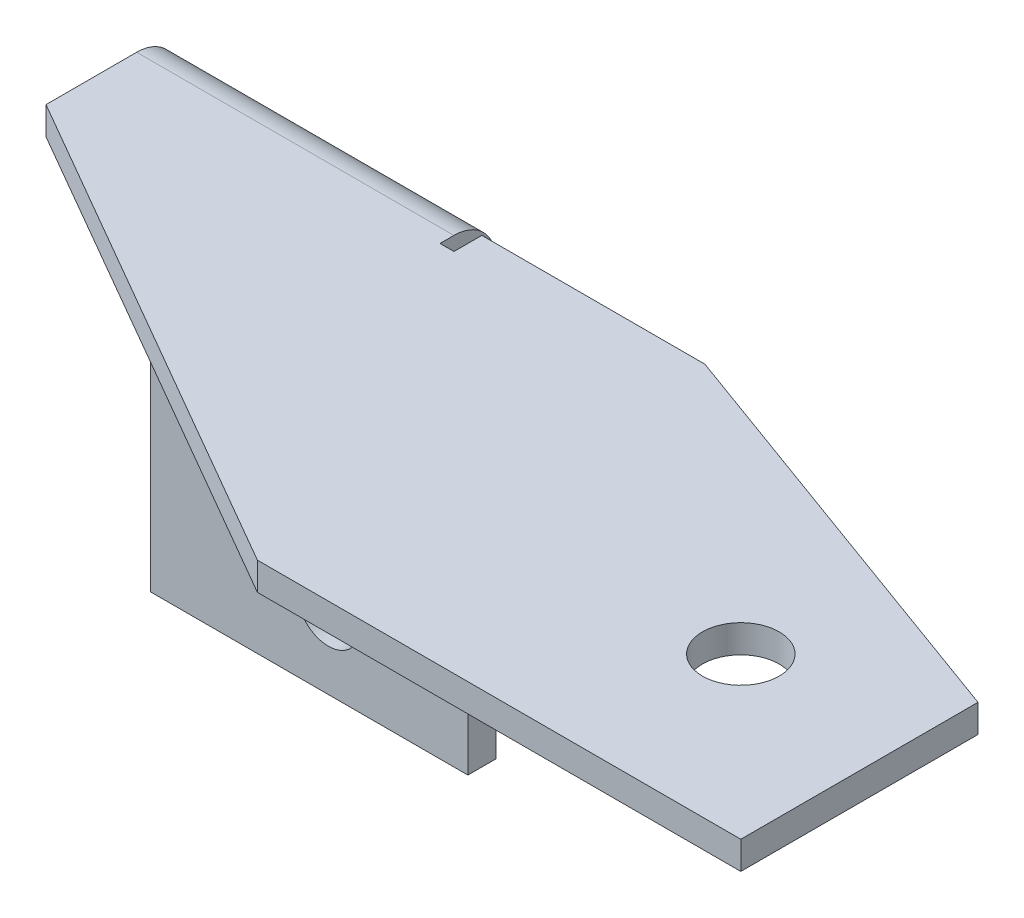
ISO-10303-21;
HEADER;
FILE_DESCRIPTION(('STEP AP214'),'2;1');
FILE_NAME('part.step','',(''),(''),'','','');
FILE_SCHEMA(('AUTOMOTIVE_DESIGN { 1 0 10303 214 1 1 1 1 }'));
ENDSEC;
DATA;
#1=APPLICATION_CONTEXT('core data for automotive mechanical design processes');
#2=APPLICATION_PROTOCOL_DEFINITION('international standard','automotive_design',2000,#1);
#3=PRODUCT_CONTEXT('',#1,'mechanical');
#4=PRODUCT('Part','Part','',(#3));
#5=PRODUCT_RELATED_PRODUCT_CATEGORY('part','',(#4));
#6=PRODUCT_DEFINITION_FORMATION('','',#4);
#7=PRODUCT_DEFINITION_CONTEXT('part definition',#1,'design');
#8=PRODUCT_DEFINITION('design','',#6,#7);
#9=PRODUCT_DEFINITION_SHAPE('','',#8);
#10=(LENGTH_UNIT() NAMED_UNIT(*) SI_UNIT(.MILLI.,.METRE.));
#11=(NAMED_UNIT(*) PLANE_ANGLE_UNIT() SI_UNIT($,.RADIAN.));
#12=(NAMED_UNIT(*) SI_UNIT($,.STERADIAN.) SOLID_ANGLE_UNIT());
#13=UNCERTAINTY_MEASURE_WITH_UNIT(LENGTH_MEASURE(1.E-05),#10,'distance_accuracy_value','');
#14=(GEOMETRIC_REPRESENTATION_CONTEXT(3) GLOBAL_UNCERTAINTY_ASSIGNED_CONTEXT((#13)) GLOBAL_UNIT_ASSIGNED_CONTEXT((#10,
#11,#12)) REPRESENTATION_CONTEXT('',''));
#15=CARTESIAN_POINT('',(0.,0.,0.));
#16=DIRECTION('',(0.,0.,1.));
#17=DIRECTION('',(1.,0.,0.));
#18=AXIS2_PLACEMENT_3D('',#15,#16,#17);
#19=CARTESIAN_POINT('',(0.,2.,0.));
#20=DIRECTION('',(0.,0.,1.));
#21=DIRECTION('',(1.,0.,0.));
#22=AXIS2_PLACEMENT_3D('',#19,#20,#21);
#23=PLANE('',#22);
#24=DIRECTION('',(0.,-1.,0.));
#25=VECTOR('',#24,1.);
#26=CARTESIAN_POINT('',(22.7379024351809,2.,0.));
#27=LINE('',#26,#25);
#28=CARTESIAN_POINT('',(22.7379024351809,-1.,0.));
#29=VERTEX_POINT('',#28);
#30=CARTESIAN_POINT('',(22.7379024351809,-32.,0.));
#31=VERTEX_POINT('',#30);
#32=EDGE_CURVE('E340',#29,#31,#27,.T.);
#33=ORIENTED_EDGE('',*,*,#32,.F.);
#34=DIRECTION('',(-1.,0.,0.));
#35=VECTOR('',#34,1.);
#36=CARTESIAN_POINT('',(0.,-1.,0.));
#37=LINE('',#36,#35);
#38=CARTESIAN_POINT('',(0.,-1.,0.));
#39=VERTEX_POINT('',#38);
#40=EDGE_CURVE('E426',#29,#39,#37,.T.);
#41=ORIENTED_EDGE('',*,*,#40,.T.);
#42=DIRECTION('',(0.,-1.,0.));
#43=VECTOR('',#42,1.);
#44=CARTESIAN_POINT('',(0.,2.,0.));
#45=LINE('',#44,#43);
#46=CARTESIAN_POINT('',(0.,-32.,0.));
#47=VERTEX_POINT('',#46);
#48=EDGE_CURVE('E336',#39,#47,#45,.T.);
#49=ORIENTED_EDGE('',*,*,#48,.T.);
#50=DIRECTION('',(-1.,0.,0.));
#51=VECTOR('',#50,1.);
#52=CARTESIAN_POINT('',(0.,-32.,0.));
#53=LINE('',#52,#51);
#54=EDGE_CURVE('E329',#31,#47,#53,.T.);
#55=ORIENTED_EDGE('',*,*,#54,.F.);
#56=EDGE_LOOP('',(#33,#41,#49,#55));
#57=FACE_BOUND('',#56,.T.);
#58=DIRECTION('',(0.,-1.,0.));
#59=VECTOR('',#58,1.);
#60=CARTESIAN_POINT('',(14.9879024351809,-12.25,0.));
#61=LINE('',#60,#59);
#62=CARTESIAN_POINT('',(14.9879024351809,-6.75000000000001,0.));
#63=VERTEX_POINT('',#62);
#64=CARTESIAN_POINT('',(14.9879024351809,-12.25,0.));
#65=VERTEX_POINT('',#64);
#66=EDGE_CURVE('E291',#63,#65,#61,.T.);
#67=ORIENTED_EDGE('',*,*,#66,.T.);
#68=CARTESIAN_POINT('',(12.7379024351809,-12.25,0.));
#69=DIRECTION('',(0.,0.,-1.));
#70=DIRECTION('',(-1.,0.,0.));
#71=AXIS2_PLACEMENT_3D('',#68,#69,#70);
#72=CIRCLE('',#71,2.25);
#73=CARTESIAN_POINT('',(10.4879024351809,-12.25,0.));
#74=VERTEX_POINT('',#73);
#75=EDGE_CURVE('E252',#65,#74,#72,.T.);
#76=ORIENTED_EDGE('',*,*,#75,.T.);
#77=DIRECTION('',(0.,1.,0.));
#78=VECTOR('',#77,1.);
#79=CARTESIAN_POINT('',(10.4879024351809,-12.25,0.));
#80=LINE('',#79,#78);
#81=CARTESIAN_POINT('',(10.4879024351809,-6.75000000000001,0.));
#82=VERTEX_POINT('',#81);
#83=EDGE_CURVE('E300',#74,#82,#80,.T.);
#84=ORIENTED_EDGE('',*,*,#83,.T.);
#85=CARTESIAN_POINT('',(12.7379024351809,-6.75000000000001,0.));
#86=DIRECTION('',(0.,0.,-1.));
#87=DIRECTION('',(-1.,0.,0.));
#88=AXIS2_PLACEMENT_3D('',#85,#86,#87);
#89=CIRCLE('',#88,2.25);
#90=EDGE_CURVE('E295',#82,#63,#89,.T.);
#91=ORIENTED_EDGE('',*,*,#90,.T.);
#92=EDGE_LOOP('',(#67,#76,#84,#91));
#93=FACE_BOUND('',#92,.T.);
#94=DIRECTION('',(0.,-1.,0.));
#95=VECTOR('',#94,1.);
#96=CARTESIAN_POINT('',(14.9879024351809,-26.75,0.));
#97=LINE('',#96,#95);
#98=CARTESIAN_POINT('',(14.9879024351809,-21.25,0.));
#99=VERTEX_POINT('',#98);
#100=CARTESIAN_POINT('',(14.9879024351809,-26.75,0.));
#101=VERTEX_POINT('',#100);
#102=EDGE_CURVE('E236',#99,#101,#97,.T.);
#103=ORIENTED_EDGE('',*,*,#102,.T.);
#104=CARTESIAN_POINT('',(12.7379024351809,-26.75,0.));
#105=DIRECTION('',(0.,0.,-1.));
#106=DIRECTION('',(-1.,0.,0.));
#107=AXIS2_PLACEMENT_3D('',#104,#105,#106);
#108=CIRCLE('',#107,2.25);
#109=CARTESIAN_POINT('',(10.4879024351809,-26.75,0.));
#110=VERTEX_POINT('',#109);
#111=EDGE_CURVE('E247',#101,#110,#108,.T.);
#112=ORIENTED_EDGE('',*,*,#111,.T.);
#113=DIRECTION('',(0.,1.,0.));
#114=VECTOR('',#113,1.);
#115=CARTESIAN_POINT('',(10.4879024351809,-26.75,0.));
#116=LINE('',#115,#114);
#117=CARTESIAN_POINT('',(10.4879024351809,-21.25,0.));
#118=VERTEX_POINT('',#117);
#119=EDGE_CURVE('E251',#110,#118,#116,.T.);
#120=ORIENTED_EDGE('',*,*,#119,.T.);
#121=CARTESIAN_POINT('',(12.7379024351809,-21.25,0.));
#122=DIRECTION('',(0.,0.,-1.));
#123=DIRECTION('',(-1.,0.,0.));
#124=AXIS2_PLACEMENT_3D('',#121,#122,#123);
#125=CIRCLE('',#124,2.25);
#126=EDGE_CURVE('E256',#118,#99,#125,.T.);
#127=ORIENTED_EDGE('',*,*,#126,.T.);
#128=EDGE_LOOP('',(#103,#112,#120,#127));
#129=FACE_BOUND('',#128,.T.);
#130=ADVANCED_FACE('F42',(#57,#93,#129),#23,.T.);
#131=CARTESIAN_POINT('',(22.7379024351809,2.,-2.));
#132=DIRECTION('',(0.,0.,-1.));
#133=DIRECTION('',(-1.,0.,0.));
#134=AXIS2_PLACEMENT_3D('',#131,#132,#133);
#135=PLANE('',#134);
#136=DIRECTION('',(0.,-1.,0.));
#137=VECTOR('',#136,1.);
#138=CARTESIAN_POINT('',(0.,2.,-2.));
#139=LINE('',#138,#137);
#140=CARTESIAN_POINT('',(0.,-1.,-2.));
#141=VERTEX_POINT('',#140);
#142=CARTESIAN_POINT('',(0.,-32.,-2.));
#143=VERTEX_POINT('',#142);
#144=EDGE_CURVE('E335',#141,#143,#139,.T.);
#145=ORIENTED_EDGE('',*,*,#144,.F.);
#146=DIRECTION('',(1.,0.,0.));
#147=VECTOR('',#146,1.);
#148=CARTESIAN_POINT('',(22.7379024351809,-1.,-2.));
#149=LINE('',#148,#147);
#150=CARTESIAN_POINT('',(22.7379024351809,-1.,-2.));
#151=VERTEX_POINT('',#150);
#152=EDGE_CURVE('E413',#141,#151,#149,.T.);
#153=ORIENTED_EDGE('',*,*,#152,.T.);
#154=DIRECTION('',(0.,-1.,0.));
#155=VECTOR('',#154,1.);
#156=CARTESIAN_POINT('',(22.7379024351809,2.,-2.));
#157=LINE('',#156,#155);
#158=CARTESIAN_POINT('',(22.7379024351809,-32.,-2.));
#159=VERTEX_POINT('',#158);
#160=EDGE_CURVE('E343',#151,#159,#157,.T.);
#161=ORIENTED_EDGE('',*,*,#160,.T.);
#162=DIRECTION('',(1.,0.,0.));
#163=VECTOR('',#162,1.);
#164=CARTESIAN_POINT('',(22.7379024351809,-32.,-2.));
#165=LINE('',#164,#163);
#166=EDGE_CURVE('E321',#143,#159,#165,.T.);
#167=ORIENTED_EDGE('',*,*,#166,.F.);
#168=EDGE_LOOP('',(#145,#153,#161,#167));
#169=FACE_BOUND('',#168,.T.);
#170=DIRECTION('',(0.,1.,0.));
#171=VECTOR('',#170,1.);
#172=CARTESIAN_POINT('',(10.4879024351809,-12.25,-2.));
#173=LINE('',#172,#171);
#174=CARTESIAN_POINT('',(10.4879024351809,-12.25,-2.));
#175=VERTEX_POINT('',#174);
#176=CARTESIAN_POINT('',(10.4879024351809,-6.75000000000001,-2.));
#177=VERTEX_POINT('',#176);
#178=EDGE_CURVE('E313',#175,#177,#173,.T.);
#179=ORIENTED_EDGE('',*,*,#178,.F.);
#180=CARTESIAN_POINT('',(12.7379024351809,-12.25,-2.));
#181=DIRECTION('',(0.,0.,-1.));
#182=DIRECTION('',(-1.,0.,0.));
#183=AXIS2_PLACEMENT_3D('',#180,#181,#182);
#184=CIRCLE('',#183,2.25);
#185=CARTESIAN_POINT('',(14.9879024351809,-12.25,-2.));
#186=VERTEX_POINT('',#185);
#187=EDGE_CURVE('E296',#186,#175,#184,.T.);
#188=ORIENTED_EDGE('',*,*,#187,.F.);
#189=DIRECTION('',(0.,-1.,0.));
#190=VECTOR('',#189,1.);
#191=CARTESIAN_POINT('',(14.9879024351809,-12.25,-2.));
#192=LINE('',#191,#190);
#193=CARTESIAN_POINT('',(14.9879024351809,-6.75000000000001,-2.));
#194=VERTEX_POINT('',#193);
#195=EDGE_CURVE('E290',#194,#186,#192,.T.);
#196=ORIENTED_EDGE('',*,*,#195,.F.);
#197=CARTESIAN_POINT('',(12.7379024351809,-6.75000000000001,-2.));
#198=DIRECTION('',(0.,0.,-1.));
#199=DIRECTION('',(-1.,0.,0.));
#200=AXIS2_PLACEMENT_3D('',#197,#198,#199);
#201=CIRCLE('',#200,2.25);
#202=EDGE_CURVE('E309',#177,#194,#201,.T.);
#203=ORIENTED_EDGE('',*,*,#202,.F.);
#204=EDGE_LOOP('',(#179,#188,#196,#203));
#205=FACE_BOUND('',#204,.T.);
#206=DIRECTION('',(0.,1.,0.));
#207=VECTOR('',#206,1.);
#208=CARTESIAN_POINT('',(10.4879024351809,-26.75,-2.));
#209=LINE('',#208,#207);
#210=CARTESIAN_POINT('',(10.4879024351809,-26.75,-2.));
#211=VERTEX_POINT('',#210);
#212=CARTESIAN_POINT('',(10.4879024351809,-21.25,-2.));
#213=VERTEX_POINT('',#212);
#214=EDGE_CURVE('E235',#211,#213,#209,.T.);
#215=ORIENTED_EDGE('',*,*,#214,.F.);
#216=CARTESIAN_POINT('',(12.7379024351809,-26.75,-2.));
#217=DIRECTION('',(0.,0.,-1.));
#218=DIRECTION('',(-1.,0.,0.));
#219=AXIS2_PLACEMENT_3D('',#216,#217,#218);
#220=CIRCLE('',#219,2.25);
#221=CARTESIAN_POINT('',(14.9879024351809,-26.75,-2.));
#222=VERTEX_POINT('',#221);
#223=EDGE_CURVE('E232',#222,#211,#220,.T.);
#224=ORIENTED_EDGE('',*,*,#223,.F.);
#225=DIRECTION('',(0.,-1.,0.));
#226=VECTOR('',#225,1.);
#227=CARTESIAN_POINT('',(14.9879024351809,-26.75,-2.));
#228=LINE('',#227,#226);
#229=CARTESIAN_POINT('',(14.9879024351809,-21.25,-2.));
#230=VERTEX_POINT('',#229);
#231=EDGE_CURVE('E243',#230,#222,#228,.T.);
#232=ORIENTED_EDGE('',*,*,#231,.F.);
#233=CARTESIAN_POINT('',(12.7379024351809,-21.25,-2.));
#234=DIRECTION('',(0.,0.,-1.));
#235=DIRECTION('',(-1.,0.,0.));
#236=AXIS2_PLACEMENT_3D('',#233,#234,#235);
#237=CIRCLE('',#236,2.25);
#238=EDGE_CURVE('E239',#213,#230,#237,.T.);
#239=ORIENTED_EDGE('',*,*,#238,.F.);
#240=EDGE_LOOP('',(#215,#224,#232,#239));
#241=FACE_BOUND('',#240,.T.);
#242=ADVANCED_FACE('F453',(#169,#205,#241),#135,.T.);
#243=CARTESIAN_POINT('',(0.,2.,0.));
#244=DIRECTION('',(0.,0.,1.));
#245=DIRECTION('',(1.,0.,0.));
#246=AXIS2_PLACEMENT_3D('',#243,#244,#245);
#247=PLANE('',#246);
#248=DIRECTION('',(-1.,0.,0.));
#249=VECTOR('',#248,1.);
#250=CARTESIAN_POINT('',(0.,0.,0.));
#251=LINE('',#250,#249);
#252=CARTESIAN_POINT('',(39.7282529021083,0.,0.));
#253=VERTEX_POINT('',#252);
#254=CARTESIAN_POINT('',(23.7379024351809,0.,0.));
#255=VERTEX_POINT('',#254);
#256=EDGE_CURVE('E360',#253,#255,#251,.T.);
#257=ORIENTED_EDGE('',*,*,#256,.T.);
#258=DIRECTION('',(0.,1.,0.));
#259=VECTOR('',#258,1.);
#260=CARTESIAN_POINT('',(23.7379024351809,0.,0.));
#261=LINE('',#260,#259);
#262=CARTESIAN_POINT('',(23.7379024351809,2.,0.));
#263=VERTEX_POINT('',#262);
#264=EDGE_CURVE('E225',#255,#263,#261,.T.);
#265=ORIENTED_EDGE('',*,*,#264,.T.);
#266=DIRECTION('',(-1.,0.,0.));
#267=VECTOR('',#266,1.);
#268=CARTESIAN_POINT('',(0.,2.,0.));
#269=LINE('',#268,#267);
#270=CARTESIAN_POINT('',(39.7282529021083,2.,0.));
#271=VERTEX_POINT('',#270);
#272=EDGE_CURVE('E372',#271,#263,#269,.T.);
#273=ORIENTED_EDGE('',*,*,#272,.F.);
#274=DIRECTION('',(0.,-1.,0.));
#275=VECTOR('',#274,1.);
#276=CARTESIAN_POINT('',(39.7282529021083,2.,0.));
#277=LINE('',#276,#275);
#278=EDGE_CURVE('E376',#271,#253,#277,.T.);
#279=ORIENTED_EDGE('',*,*,#278,.T.);
#280=EDGE_LOOP('',(#257,#265,#273,#279));
#281=FACE_BOUND('',#280,.T.);
#282=ADVANCED_FACE('F458',(#281),#247,.F.);
#283=CARTESIAN_POINT('',(0.,2.,7.5));
#284=DIRECTION('',(1.,0.,0.));
#285=DIRECTION('',(0.,0.,-1.));
#286=AXIS2_PLACEMENT_3D('',#283,#284,#285);
#287=PLANE('',#286);
#288=DIRECTION('',(0.,0.,1.));
#289=VECTOR('',#288,1.);
#290=CARTESIAN_POINT('',(0.,2.,7.5));
#291=LINE('',#290,#289);
#292=CARTESIAN_POINT('',(0.,2.,0.999999999999998));
#293=VERTEX_POINT('',#292);
#294=CARTESIAN_POINT('',(0.,2.,7.5));
#295=VERTEX_POINT('',#294);
#296=EDGE_CURVE('E356',#293,#295,#291,.T.);
#297=ORIENTED_EDGE('',*,*,#296,.F.);
#298=CARTESIAN_POINT('',(0.,-1.,0.999999999999997));
#299=DIRECTION('',(1.,0.,0.));
#300=DIRECTION('',(0.,0.,-1.));
#301=AXIS2_PLACEMENT_3D('',#298,#299,#300);
#302=CIRCLE('',#301,3.);
#303=EDGE_CURVE('E423',#293,#141,#302,.F.);
#304=ORIENTED_EDGE('',*,*,#303,.T.);
#305=ORIENTED_EDGE('',*,*,#144,.T.);
#306=DIRECTION('',(0.,0.,-1.));
#307=VECTOR('',#306,1.);
#308=CARTESIAN_POINT('',(0.,-32.,-2.));
#309=LINE('',#308,#307);
#310=EDGE_CURVE('E276',#47,#143,#309,.T.);
#311=ORIENTED_EDGE('',*,*,#310,.F.);
#312=ORIENTED_EDGE('',*,*,#48,.F.);
#313=CARTESIAN_POINT('',(0.,-1.,1.));
#314=DIRECTION('',(1.,0.,0.));
#315=DIRECTION('',(0.,0.,-1.));
#316=AXIS2_PLACEMENT_3D('',#313,#314,#315);
#317=CIRCLE('',#316,1.);
#318=CARTESIAN_POINT('',(0.,0.,1.));
#319=VERTEX_POINT('',#318);
#320=EDGE_CURVE('E51',#39,#319,#317,.T.);
#321=ORIENTED_EDGE('',*,*,#320,.T.);
#322=DIRECTION('',(0.,0.,1.));
#323=VECTOR('',#322,1.);
#324=CARTESIAN_POINT('',(0.,0.,7.5));
#325=LINE('',#324,#323);
#326=CARTESIAN_POINT('',(0.,0.,7.5));
#327=VERTEX_POINT('',#326);
#328=EDGE_CURVE('E352',#319,#327,#325,.T.);
#329=ORIENTED_EDGE('',*,*,#328,.T.);
#330=DIRECTION('',(0.,-1.,0.));
#331=VECTOR('',#330,1.);
#332=CARTESIAN_POINT('',(0.,2.,7.5));
#333=LINE('',#332,#331);
#334=EDGE_CURVE('E409',#295,#327,#333,.T.);
#335=ORIENTED_EDGE('',*,*,#334,.F.);
#336=EDGE_LOOP('',(#297,#304,#305,#311,#312,#321,#329,#335));
#337=FACE_BOUND('',#336,.T.);
#338=ADVANCED_FACE('F440',(#337),#287,.F.);
#339=CARTESIAN_POINT('',(35.853451716676,2.,28.2));
#340=DIRECTION('',(0.499999999999998,0.,-0.86602540378444));
#341=DIRECTION('',(-0.86602540378444,0.,-0.499999999999998));
#342=AXIS2_PLACEMENT_3D('',#339,#340,#341);
#343=PLANE('',#342);
#344=DIRECTION('',(0.86602540378444,0.,0.499999999999998));
#345=VECTOR('',#344,1.);
#346=CARTESIAN_POINT('',(35.853451716676,0.,28.2));
#347=LINE('',#346,#345);
#348=CARTESIAN_POINT('',(35.853451716676,0.,28.2));
#349=VERTEX_POINT('',#348);
#350=EDGE_CURVE('E379',#327,#349,#347,.T.);
#351=ORIENTED_EDGE('',*,*,#350,.T.);
#352=DIRECTION('',(0.,-1.,0.));
#353=VECTOR('',#352,1.);
#354=CARTESIAN_POINT('',(35.853451716676,2.,28.2));
#355=LINE('',#354,#353);
#356=CARTESIAN_POINT('',(35.853451716676,2.,28.2));
#357=VERTEX_POINT('',#356);
#358=EDGE_CURVE('E405',#357,#349,#355,.T.);
#359=ORIENTED_EDGE('',*,*,#358,.F.);
#360=DIRECTION('',(0.86602540378444,0.,0.499999999999998));
#361=VECTOR('',#360,1.);
#362=CARTESIAN_POINT('',(35.853451716676,2.,28.2));
#363=LINE('',#362,#361);
#364=EDGE_CURVE('E359',#295,#357,#363,.T.);
#365=ORIENTED_EDGE('',*,*,#364,.F.);
#366=ORIENTED_EDGE('',*,*,#334,.T.);
#367=EDGE_LOOP('',(#351,#359,#365,#366));
#368=FACE_BOUND('',#367,.T.);
#369=ADVANCED_FACE('F490',(#368),#343,.F.);
#370=CARTESIAN_POINT('',(70.5,2.,28.2));
#371=DIRECTION('',(0.,0.,-1.));
#372=DIRECTION('',(-1.,0.,0.));
#373=AXIS2_PLACEMENT_3D('',#370,#371,#372);
#374=PLANE('',#373);
#375=DIRECTION('',(1.,0.,0.));
#376=VECTOR('',#375,1.);
#377=CARTESIAN_POINT('',(70.5,0.,28.2));
#378=LINE('',#377,#376);
#379=CARTESIAN_POINT('',(70.5,0.,28.2));
#380=VERTEX_POINT('',#379);
#381=EDGE_CURVE('E382',#349,#380,#378,.T.);
#382=ORIENTED_EDGE('',*,*,#381,.T.);
#383=DIRECTION('',(0.,-1.,0.));
#384=VECTOR('',#383,1.);
#385=CARTESIAN_POINT('',(70.5,2.,28.2));
#386=LINE('',#385,#384);
#387=CARTESIAN_POINT('',(70.5,2.,28.2));
#388=VERTEX_POINT('',#387);
#389=EDGE_CURVE('E401',#388,#380,#386,.T.);
#390=ORIENTED_EDGE('',*,*,#389,.F.);
#391=DIRECTION('',(1.,0.,0.));
#392=VECTOR('',#391,1.);
#393=CARTESIAN_POINT('',(70.5,2.,28.2));
#394=LINE('',#393,#392);
#395=EDGE_CURVE('E363',#357,#388,#394,.T.);
#396=ORIENTED_EDGE('',*,*,#395,.F.);
#397=ORIENTED_EDGE('',*,*,#358,.T.);
#398=EDGE_LOOP('',(#382,#390,#396,#397));
#399=FACE_BOUND('',#398,.T.);
#400=ADVANCED_FACE('F486',(#399),#374,.F.);
#401=CARTESIAN_POINT('',(70.5,2.,11.2));
#402=DIRECTION('',(-1.,0.,0.));
#403=DIRECTION('',(0.,0.,1.));
#404=AXIS2_PLACEMENT_3D('',#401,#402,#403);
#405=PLANE('',#404);
#406=DIRECTION('',(0.,0.,-1.));
#407=VECTOR('',#406,1.);
#408=CARTESIAN_POINT('',(70.5,0.,11.2));
#409=LINE('',#408,#407);
#410=CARTESIAN_POINT('',(70.5,0.,11.2));
#411=VERTEX_POINT('',#410);
#412=EDGE_CURVE('E385',#380,#411,#409,.T.);
#413=ORIENTED_EDGE('',*,*,#412,.T.);
#414=DIRECTION('',(0.,-1.,0.));
#415=VECTOR('',#414,1.);
#416=CARTESIAN_POINT('',(70.5,2.,11.2));
#417=LINE('',#416,#415);
#418=CARTESIAN_POINT('',(70.5,2.,11.2));
#419=VERTEX_POINT('',#418);
#420=EDGE_CURVE('E397',#419,#411,#417,.T.);
#421=ORIENTED_EDGE('',*,*,#420,.F.);
#422=DIRECTION('',(0.,0.,-1.));
#423=VECTOR('',#422,1.);
#424=CARTESIAN_POINT('',(70.5,2.,11.2));
#425=LINE('',#424,#423);
#426=EDGE_CURVE('E366',#388,#419,#425,.T.);
#427=ORIENTED_EDGE('',*,*,#426,.F.);
#428=ORIENTED_EDGE('',*,*,#389,.T.);
#429=EDGE_LOOP('',(#413,#421,#427,#428));
#430=FACE_BOUND('',#429,.T.);
#431=ADVANCED_FACE('F482',(#430),#405,.F.);
#432=CARTESIAN_POINT('',(39.7282529021083,2.,0.));
#433=DIRECTION('',(-0.34202014332567,0.,0.939692620785908));
#434=DIRECTION('',(0.939692620785908,0.,0.34202014332567));
#435=AXIS2_PLACEMENT_3D('',#432,#433,#434);
#436=PLANE('',#435);
#437=DIRECTION('',(-0.939692620785908,0.,-0.34202014332567));
#438=VECTOR('',#437,1.);
#439=CARTESIAN_POINT('',(39.7282529021083,0.,0.));
#440=LINE('',#439,#438);
#441=EDGE_CURVE('E388',#411,#253,#440,.T.);
#442=ORIENTED_EDGE('',*,*,#441,.T.);
#443=ORIENTED_EDGE('',*,*,#278,.F.);
#444=DIRECTION('',(-0.939692620785908,0.,-0.34202014332567));
#445=VECTOR('',#444,1.);
#446=CARTESIAN_POINT('',(39.7282529021083,2.,0.));
#447=LINE('',#446,#445);
#448=EDGE_CURVE('E369',#419,#271,#447,.T.);
#449=ORIENTED_EDGE('',*,*,#448,.F.);
#450=ORIENTED_EDGE('',*,*,#420,.T.);
#451=EDGE_LOOP('',(#442,#443,#449,#450));
#452=FACE_BOUND('',#451,.T.);
#453=ADVANCED_FACE('F473',(#452),#436,.F.);
#454=CARTESIAN_POINT('',(0.,2.,0.));
#455=DIRECTION('',(0.,-1.,0.));
#456=DIRECTION('',(0.,0.,-1.));
#457=AXIS2_PLACEMENT_3D('',#454,#455,#456);
#458=PLANE('',#457);
#459=CARTESIAN_POINT('',(59.,2.,16.7));
#460=DIRECTION('',(0.,1.,0.));
#461=DIRECTION('',(0.,0.,1.));
#462=AXIS2_PLACEMENT_3D('',#459,#460,#461);
#463=CIRCLE('',#462,2.75);
#464=CARTESIAN_POINT('',(59.,2.,19.45));
#465=VERTEX_POINT('',#464);
#466=EDGE_CURVE('E339',#465,#465,#463,.T.);
#467=ORIENTED_EDGE('',*,*,#466,.F.);
#468=EDGE_LOOP('',(#467));
#469=FACE_BOUND('',#468,.T.);
#470=DIRECTION('',(0.,0.,1.));
#471=VECTOR('',#470,1.);
#472=CARTESIAN_POINT('',(22.7379024351809,2.,0.));
#473=LINE('',#472,#471);
#474=CARTESIAN_POINT('',(22.7379024351809,2.,1.));
#475=VERTEX_POINT('',#474);
#476=CARTESIAN_POINT('',(22.7379024351809,2.,2.));
#477=VERTEX_POINT('',#476);
#478=EDGE_CURVE('E205',#475,#477,#473,.T.);
#479=ORIENTED_EDGE('',*,*,#478,.F.);
#480=DIRECTION('',(1.,0.,0.));
#481=VECTOR('',#480,1.);
#482=CARTESIAN_POINT('',(0.,2.,0.999999999999997));
#483=LINE('',#482,#481);
#484=EDGE_CURVE('E420',#475,#293,#483,.F.);
#485=ORIENTED_EDGE('',*,*,#484,.T.);
#486=ORIENTED_EDGE('',*,*,#296,.T.);
#487=ORIENTED_EDGE('',*,*,#364,.T.);
#488=ORIENTED_EDGE('',*,*,#395,.T.);
#489=ORIENTED_EDGE('',*,*,#426,.T.);
#490=ORIENTED_EDGE('',*,*,#448,.T.);
#491=ORIENTED_EDGE('',*,*,#272,.T.);
#492=DIRECTION('',(0.,0.,-1.));
#493=VECTOR('',#492,1.);
#494=CARTESIAN_POINT('',(23.7379024351809,2.,2.));
#495=LINE('',#494,#493);
#496=CARTESIAN_POINT('',(23.7379024351809,2.,2.));
#497=VERTEX_POINT('',#496);
#498=EDGE_CURVE('E198',#497,#263,#495,.T.);
#499=ORIENTED_EDGE('',*,*,#498,.F.);
#500=DIRECTION('',(1.,0.,0.));
#501=VECTOR('',#500,1.);
#502=CARTESIAN_POINT('',(22.7379024351809,2.,2.));
#503=LINE('',#502,#501);
#504=EDGE_CURVE('E220',#477,#497,#503,.T.);
#505=ORIENTED_EDGE('',*,*,#504,.F.);
#506=EDGE_LOOP('',(#479,#485,#486,#487,#488,#489,#490,#491,#499,#505));
#507=FACE_BOUND('',#506,.T.);
#508=ADVANCED_FACE('F470',(#469,#507),#458,.F.);
#509=CARTESIAN_POINT('',(0.,0.,0.));
#510=DIRECTION('',(0.,-1.,0.));
#511=DIRECTION('',(0.,0.,-1.));
#512=AXIS2_PLACEMENT_3D('',#509,#510,#511);
#513=PLANE('',#512);
#514=ORIENTED_EDGE('',*,*,#328,.F.);
#515=DIRECTION('',(-1.,0.,0.));
#516=VECTOR('',#515,1.);
#517=CARTESIAN_POINT('',(22.7379024351809,0.,1.));
#518=LINE('',#517,#516);
#519=CARTESIAN_POINT('',(22.7379024351809,0.,1.));
#520=VERTEX_POINT('',#519);
#521=EDGE_CURVE('E58',#319,#520,#518,.F.);
#522=ORIENTED_EDGE('',*,*,#521,.T.);
#523=DIRECTION('',(0.,0.,1.));
#524=VECTOR('',#523,1.);
#525=CARTESIAN_POINT('',(22.7379024351809,0.,0.));
#526=LINE('',#525,#524);
#527=CARTESIAN_POINT('',(22.7379024351809,0.,2.));
#528=VERTEX_POINT('',#527);
#529=EDGE_CURVE('E188',#520,#528,#526,.T.);
#530=ORIENTED_EDGE('',*,*,#529,.T.);
#531=DIRECTION('',(1.,0.,0.));
#532=VECTOR('',#531,1.);
#533=CARTESIAN_POINT('',(22.7379024351809,0.,2.));
#534=LINE('',#533,#532);
#535=CARTESIAN_POINT('',(23.7379024351809,0.,2.));
#536=VERTEX_POINT('',#535);
#537=EDGE_CURVE('E194',#528,#536,#534,.T.);
#538=ORIENTED_EDGE('',*,*,#537,.T.);
#539=DIRECTION('',(0.,0.,-1.));
#540=VECTOR('',#539,1.);
#541=CARTESIAN_POINT('',(23.7379024351809,0.,2.));
#542=LINE('',#541,#540);
#543=EDGE_CURVE('E211',#536,#255,#542,.T.);
#544=ORIENTED_EDGE('',*,*,#543,.T.);
#545=ORIENTED_EDGE('',*,*,#256,.F.);
#546=ORIENTED_EDGE('',*,*,#441,.F.);
#547=ORIENTED_EDGE('',*,*,#412,.F.);
#548=ORIENTED_EDGE('',*,*,#381,.F.);
#549=ORIENTED_EDGE('',*,*,#350,.F.);
#550=EDGE_LOOP('',(#514,#522,#530,#538,#544,#545,#546,#547,#548,#549));
#551=FACE_BOUND('',#550,.T.);
#552=CARTESIAN_POINT('',(59.,0.,16.7));
#553=DIRECTION('',(0.,1.,0.));
#554=DIRECTION('',(0.,0.,1.));
#555=AXIS2_PLACEMENT_3D('',#552,#553,#554);
#556=CIRCLE('',#555,2.75);
#557=CARTESIAN_POINT('',(59.,0.,19.45));
#558=VERTEX_POINT('',#557);
#559=EDGE_CURVE('E348',#558,#558,#556,.T.);
#560=ORIENTED_EDGE('',*,*,#559,.T.);
#561=EDGE_LOOP('',(#560));
#562=FACE_BOUND('',#561,.T.);
#563=ADVANCED_FACE('F190',(#551,#562),#513,.T.);
#564=CARTESIAN_POINT('',(59.,0.,16.7));
#565=DIRECTION('',(0.,1.,0.));
#566=DIRECTION('',(0.,0.,1.));
#567=AXIS2_PLACEMENT_3D('',#564,#565,#566);
#568=CYLINDRICAL_SURFACE('',#567,2.75);
#569=ORIENTED_EDGE('',*,*,#559,.F.);
#570=EDGE_LOOP('',(#569));
#571=FACE_BOUND('',#570,.T.);
#572=ORIENTED_EDGE('',*,*,#466,.T.);
#573=EDGE_LOOP('',(#572));
#574=FACE_BOUND('',#573,.T.);
#575=ADVANCED_FACE('F465',(#571,#574),#568,.F.);
#576=CARTESIAN_POINT('',(22.7379024351809,2.,0.));
#577=DIRECTION('',(1.,0.,0.));
#578=DIRECTION('',(0.,0.,-1.));
#579=AXIS2_PLACEMENT_3D('',#576,#577,#578);
#580=PLANE('',#579);
#581=ORIENTED_EDGE('',*,*,#160,.F.);
#582=CARTESIAN_POINT('',(22.7379024351809,-1.,1.));
#583=DIRECTION('',(1.,0.,0.));
#584=DIRECTION('',(0.,0.,-1.));
#585=AXIS2_PLACEMENT_3D('',#582,#583,#584);
#586=CIRCLE('',#585,3.);
#587=EDGE_CURVE('E417',#151,#475,#586,.T.);
#588=ORIENTED_EDGE('',*,*,#587,.T.);
#589=ORIENTED_EDGE('',*,*,#478,.T.);
#590=DIRECTION('',(0.,1.,0.));
#591=VECTOR('',#590,1.);
#592=CARTESIAN_POINT('',(22.7379024351809,0.,2.));
#593=LINE('',#592,#591);
#594=EDGE_CURVE('E201',#528,#477,#593,.T.);
#595=ORIENTED_EDGE('',*,*,#594,.F.);
#596=ORIENTED_EDGE('',*,*,#529,.F.);
#597=CARTESIAN_POINT('',(22.7379024351809,-1.,1.));
#598=DIRECTION('',(1.,0.,0.));
#599=DIRECTION('',(0.,0.,-1.));
#600=AXIS2_PLACEMENT_3D('',#597,#598,#599);
#601=CIRCLE('',#600,1.);
#602=EDGE_CURVE('E11',#520,#29,#601,.F.);
#603=ORIENTED_EDGE('',*,*,#602,.T.);
#604=ORIENTED_EDGE('',*,*,#32,.T.);
#605=DIRECTION('',(0.,0.,1.));
#606=VECTOR('',#605,1.);
#607=CARTESIAN_POINT('',(22.7379024351809,-32.,0.));
#608=LINE('',#607,#606);
#609=EDGE_CURVE('E325',#159,#31,#608,.T.);
#610=ORIENTED_EDGE('',*,*,#609,.F.);
#611=EDGE_LOOP('',(#581,#588,#589,#595,#596,#603,#604,#610));
#612=FACE_BOUND('',#611,.T.);
#613=ADVANCED_FACE('F203',(#612),#580,.T.);
#614=CARTESIAN_POINT('',(0.,-32.,0.));
#615=DIRECTION('',(0.,1.,0.));
#616=DIRECTION('',(0.,0.,1.));
#617=AXIS2_PLACEMENT_3D('',#614,#615,#616);
#618=PLANE('',#617);
#619=ORIENTED_EDGE('',*,*,#310,.T.);
#620=ORIENTED_EDGE('',*,*,#166,.T.);
#621=ORIENTED_EDGE('',*,*,#609,.T.);
#622=ORIENTED_EDGE('',*,*,#54,.T.);
#623=EDGE_LOOP('',(#619,#620,#621,#622));
#624=FACE_BOUND('',#623,.T.);
#625=ADVANCED_FACE('F444',(#624),#618,.F.);
#626=CARTESIAN_POINT('',(12.7379024351809,-12.25,-2.));
#627=DIRECTION('',(0.,0.,1.));
#628=DIRECTION('',(1.,0.,0.));
#629=AXIS2_PLACEMENT_3D('',#626,#627,#628);
#630=CYLINDRICAL_SURFACE('',#629,2.25);
#631=ORIENTED_EDGE('',*,*,#75,.F.);
#632=DIRECTION('',(0.,0.,1.));
#633=VECTOR('',#632,1.);
#634=CARTESIAN_POINT('',(14.9879024351809,-12.25,-2.));
#635=LINE('',#634,#633);
#636=EDGE_CURVE('E286',#186,#65,#635,.T.);
#637=ORIENTED_EDGE('',*,*,#636,.F.);
#638=ORIENTED_EDGE('',*,*,#187,.T.);
#639=DIRECTION('',(0.,0.,1.));
#640=VECTOR('',#639,1.);
#641=CARTESIAN_POINT('',(10.4879024351809,-12.25,-2.));
#642=LINE('',#641,#640);
#643=EDGE_CURVE('E229',#175,#74,#642,.T.);
#644=ORIENTED_EDGE('',*,*,#643,.T.);
#645=EDGE_LOOP('',(#631,#637,#638,#644));
#646=FACE_BOUND('',#645,.T.);
#647=ADVANCED_FACE('F540',(#646),#630,.F.);
#648=CARTESIAN_POINT('',(10.4879024351809,-12.25,-2.));
#649=DIRECTION('',(1.,0.,0.));
#650=DIRECTION('',(0.,1.,0.));
#651=AXIS2_PLACEMENT_3D('',#648,#649,#650);
#652=PLANE('',#651);
#653=ORIENTED_EDGE('',*,*,#83,.F.);
#654=ORIENTED_EDGE('',*,*,#643,.F.);
#655=ORIENTED_EDGE('',*,*,#178,.T.);
#656=DIRECTION('',(0.,0.,1.));
#657=VECTOR('',#656,1.);
#658=CARTESIAN_POINT('',(10.4879024351809,-6.75000000000001,-2.));
#659=LINE('',#658,#657);
#660=EDGE_CURVE('E280',#177,#82,#659,.T.);
#661=ORIENTED_EDGE('',*,*,#660,.T.);
#662=EDGE_LOOP('',(#653,#654,#655,#661));
#663=FACE_BOUND('',#662,.T.);
#664=ADVANCED_FACE('F546',(#663),#652,.T.);
#665=CARTESIAN_POINT('',(12.7379024351809,-6.75000000000001,-2.));
#666=DIRECTION('',(0.,0.,1.));
#667=DIRECTION('',(1.,0.,0.));
#668=AXIS2_PLACEMENT_3D('',#665,#666,#667);
#669=CYLINDRICAL_SURFACE('',#668,2.25);
#670=ORIENTED_EDGE('',*,*,#90,.F.);
#671=ORIENTED_EDGE('',*,*,#660,.F.);
#672=ORIENTED_EDGE('',*,*,#202,.T.);
#673=DIRECTION('',(0.,0.,1.));
#674=VECTOR('',#673,1.);
#675=CARTESIAN_POINT('',(14.9879024351809,-6.75000000000001,-2.));
#676=LINE('',#675,#674);
#677=EDGE_CURVE('E283',#194,#63,#676,.T.);
#678=ORIENTED_EDGE('',*,*,#677,.T.);
#679=EDGE_LOOP('',(#670,#671,#672,#678));
#680=FACE_BOUND('',#679,.T.);
#681=ADVANCED_FACE('F554',(#680),#669,.F.);
#682=CARTESIAN_POINT('',(14.9879024351809,-12.25,-2.));
#683=DIRECTION('',(-1.,0.,0.));
#684=DIRECTION('',(0.,-1.,0.));
#685=AXIS2_PLACEMENT_3D('',#682,#683,#684);
#686=PLANE('',#685);
#687=ORIENTED_EDGE('',*,*,#66,.F.);
#688=ORIENTED_EDGE('',*,*,#677,.F.);
#689=ORIENTED_EDGE('',*,*,#195,.T.);
#690=ORIENTED_EDGE('',*,*,#636,.T.);
#691=EDGE_LOOP('',(#687,#688,#689,#690));
#692=FACE_BOUND('',#691,.T.);
#693=ADVANCED_FACE('F562',(#692),#686,.T.);
#694=CARTESIAN_POINT('',(12.7379024351809,-26.75,-2.));
#695=DIRECTION('',(0.,0.,1.));
#696=DIRECTION('',(1.,0.,0.));
#697=AXIS2_PLACEMENT_3D('',#694,#695,#696);
#698=CYLINDRICAL_SURFACE('',#697,2.25);
#699=ORIENTED_EDGE('',*,*,#111,.F.);
#700=DIRECTION('',(0.,0.,1.));
#701=VECTOR('',#700,1.);
#702=CARTESIAN_POINT('',(14.9879024351809,-26.75,-2.));
#703=LINE('',#702,#701);
#704=EDGE_CURVE('E246',#222,#101,#703,.T.);
#705=ORIENTED_EDGE('',*,*,#704,.F.);
#706=ORIENTED_EDGE('',*,*,#223,.T.);
#707=DIRECTION('',(0.,0.,1.));
#708=VECTOR('',#707,1.);
#709=CARTESIAN_POINT('',(10.4879024351809,-26.75,-2.));
#710=LINE('',#709,#708);
#711=EDGE_CURVE('E272',#211,#110,#710,.T.);
#712=ORIENTED_EDGE('',*,*,#711,.T.);
#713=EDGE_LOOP('',(#699,#705,#706,#712));
#714=FACE_BOUND('',#713,.T.);
#715=ADVANCED_FACE('F570',(#714),#698,.F.);
#716=CARTESIAN_POINT('',(10.4879024351809,-26.75,-2.));
#717=DIRECTION('',(1.,0.,0.));
#718=DIRECTION('',(0.,0.,-1.));
#719=AXIS2_PLACEMENT_3D('',#716,#717,#718);
#720=PLANE('',#719);
#721=ORIENTED_EDGE('',*,*,#119,.F.);
#722=ORIENTED_EDGE('',*,*,#711,.F.);
#723=ORIENTED_EDGE('',*,*,#214,.T.);
#724=DIRECTION('',(0.,0.,1.));
#725=VECTOR('',#724,1.);
#726=CARTESIAN_POINT('',(10.4879024351809,-21.25,-2.));
#727=LINE('',#726,#725);
#728=EDGE_CURVE('E269',#213,#118,#727,.T.);
#729=ORIENTED_EDGE('',*,*,#728,.T.);
#730=EDGE_LOOP('',(#721,#722,#723,#729));
#731=FACE_BOUND('',#730,.T.);
#732=ADVANCED_FACE('F577',(#731),#720,.T.);
#733=CARTESIAN_POINT('',(12.7379024351809,-21.25,-2.));
#734=DIRECTION('',(0.,0.,1.));
#735=DIRECTION('',(1.,0.,0.));
#736=AXIS2_PLACEMENT_3D('',#733,#734,#735);
#737=CYLINDRICAL_SURFACE('',#736,2.25);
#738=ORIENTED_EDGE('',*,*,#126,.F.);
#739=ORIENTED_EDGE('',*,*,#728,.F.);
#740=ORIENTED_EDGE('',*,*,#238,.T.);
#741=DIRECTION('',(0.,0.,1.));
#742=VECTOR('',#741,1.);
#743=CARTESIAN_POINT('',(14.9879024351809,-21.25,-2.));
#744=LINE('',#743,#742);
#745=EDGE_CURVE('E266',#230,#99,#744,.T.);
#746=ORIENTED_EDGE('',*,*,#745,.T.);
#747=EDGE_LOOP('',(#738,#739,#740,#746));
#748=FACE_BOUND('',#747,.T.);
#749=ADVANCED_FACE('F585',(#748),#737,.F.);
#750=CARTESIAN_POINT('',(14.9879024351809,-26.75,-2.));
#751=DIRECTION('',(-1.,0.,0.));
#752=DIRECTION('',(0.,0.,1.));
#753=AXIS2_PLACEMENT_3D('',#750,#751,#752);
#754=PLANE('',#753);
#755=ORIENTED_EDGE('',*,*,#102,.F.);
#756=ORIENTED_EDGE('',*,*,#745,.F.);
#757=ORIENTED_EDGE('',*,*,#231,.T.);
#758=ORIENTED_EDGE('',*,*,#704,.T.);
#759=EDGE_LOOP('',(#755,#756,#757,#758));
#760=FACE_BOUND('',#759,.T.);
#761=ADVANCED_FACE('F593',(#760),#754,.T.);
#762=CARTESIAN_POINT('',(23.7379024351809,0.,2.));
#763=DIRECTION('',(1.,0.,0.));
#764=DIRECTION('',(0.,0.,-1.));
#765=AXIS2_PLACEMENT_3D('',#762,#763,#764);
#766=PLANE('',#765);
#767=ORIENTED_EDGE('',*,*,#498,.T.);
#768=ORIENTED_EDGE('',*,*,#264,.F.);
#769=ORIENTED_EDGE('',*,*,#543,.F.);
#770=DIRECTION('',(0.,1.,0.));
#771=VECTOR('',#770,1.);
#772=CARTESIAN_POINT('',(23.7379024351809,0.,2.));
#773=LINE('',#772,#771);
#774=EDGE_CURVE('E210',#536,#497,#773,.T.);
#775=ORIENTED_EDGE('',*,*,#774,.T.);
#776=EDGE_LOOP('',(#767,#768,#769,#775));
#777=FACE_BOUND('',#776,.T.);
#778=ADVANCED_FACE('F601',(#777),#766,.F.);
#779=CARTESIAN_POINT('',(22.7379024351809,0.,2.));
#780=DIRECTION('',(0.,0.,1.));
#781=DIRECTION('',(1.,0.,0.));
#782=AXIS2_PLACEMENT_3D('',#779,#780,#781);
#783=PLANE('',#782);
#784=ORIENTED_EDGE('',*,*,#504,.T.);
#785=ORIENTED_EDGE('',*,*,#774,.F.);
#786=ORIENTED_EDGE('',*,*,#537,.F.);
#787=ORIENTED_EDGE('',*,*,#594,.T.);
#788=EDGE_LOOP('',(#784,#785,#786,#787));
#789=FACE_BOUND('',#788,.T.);
#790=ADVANCED_FACE('F213',(#789),#783,.F.);
#791=CARTESIAN_POINT('',(22.7379024351809,-1.,1.));
#792=DIRECTION('',(-1.,0.,0.));
#793=DIRECTION('',(0.,0.,1.));
#794=AXIS2_PLACEMENT_3D('',#791,#792,#793);
#795=CYLINDRICAL_SURFACE('',#794,3.);
#796=ORIENTED_EDGE('',*,*,#303,.F.);
#797=ORIENTED_EDGE('',*,*,#484,.F.);
#798=ORIENTED_EDGE('',*,*,#587,.F.);
#799=ORIENTED_EDGE('',*,*,#152,.F.);
#800=EDGE_LOOP('',(#796,#797,#798,#799));
#801=FACE_BOUND('',#800,.T.);
#802=ADVANCED_FACE('F447',(#801),#795,.T.);
#803=CARTESIAN_POINT('',(0.,-1.,1.));
#804=DIRECTION('',(1.,0.,0.));
#805=DIRECTION('',(0.,0.,-1.));
#806=AXIS2_PLACEMENT_3D('',#803,#804,#805);
#807=CYLINDRICAL_SURFACE('',#806,1.);
#808=ORIENTED_EDGE('',*,*,#602,.F.);
#809=ORIENTED_EDGE('',*,*,#521,.F.);
#810=ORIENTED_EDGE('',*,*,#320,.F.);
#811=ORIENTED_EDGE('',*,*,#40,.F.);
#812=EDGE_LOOP('',(#808,#809,#810,#811));
#813=FACE_BOUND('',#812,.T.);
#814=ADVANCED_FACE('F44',(#813),#807,.F.);
#815=CLOSED_SHELL('',(#130,#242,#282,#338,#369,#400,#431,#453,#508,#563,#575,#613,#625,#647,
#664,#681,#693,#715,#732,#749,#761,#778,#790,#802,#814));
#816=MANIFOLD_SOLID_BREP('B2',#815);
#817=ADVANCED_BREP_SHAPE_REPRESENTATION('',(#18,#816),#14);
#818=SHAPE_DEFINITION_REPRESENTATION(#9,#817);
ENDSEC;
END-ISO-10303-21;
